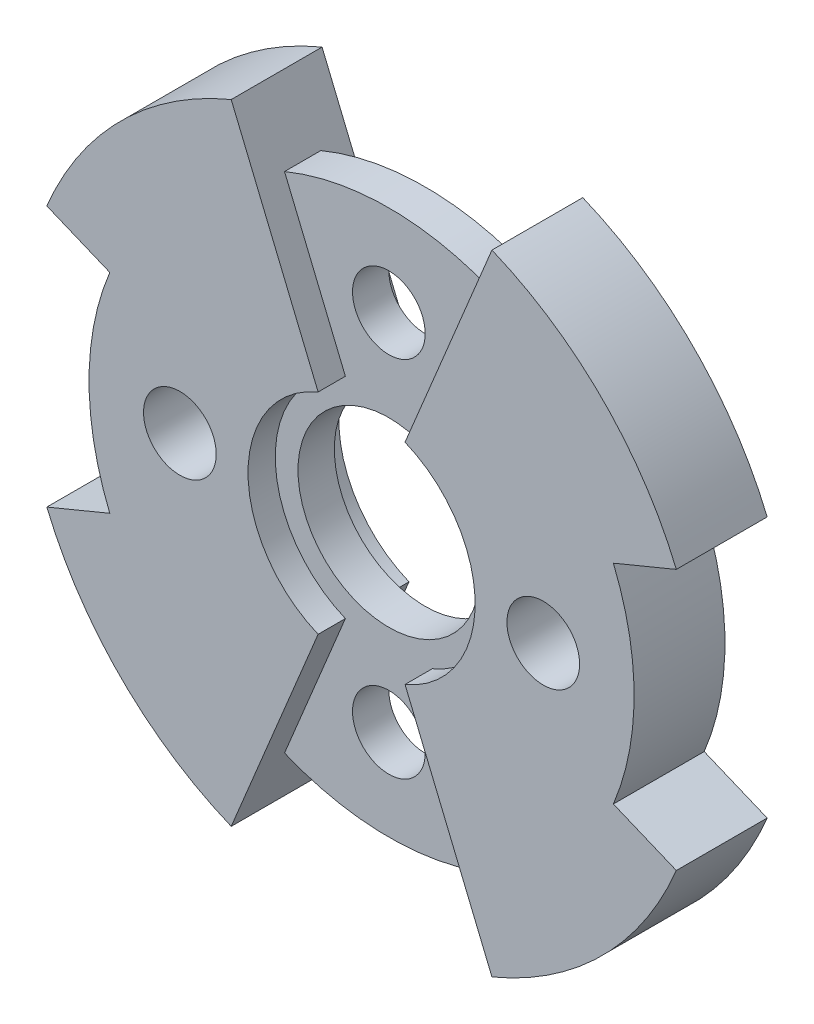
ISO-10303-21;
HEADER;
FILE_DESCRIPTION(('STEP AP214'),'2;1');
FILE_NAME('part.step','',(''),(''),'','','');
FILE_SCHEMA(('AUTOMOTIVE_DESIGN { 1 0 10303 214 1 1 1 1 }'));
ENDSEC;
DATA;
#1=APPLICATION_CONTEXT('core data for automotive mechanical design processes');
#2=APPLICATION_PROTOCOL_DEFINITION('international standard','automotive_design',2000,#1);
#3=PRODUCT_CONTEXT('',#1,'mechanical');
#4=PRODUCT('Part','Part','',(#3));
#5=PRODUCT_RELATED_PRODUCT_CATEGORY('part','',(#4));
#6=PRODUCT_DEFINITION_FORMATION('','',#4);
#7=PRODUCT_DEFINITION_CONTEXT('part definition',#1,'design');
#8=PRODUCT_DEFINITION('design','',#6,#7);
#9=PRODUCT_DEFINITION_SHAPE('','',#8);
#10=(LENGTH_UNIT() NAMED_UNIT(*) SI_UNIT(.MILLI.,.METRE.));
#11=(NAMED_UNIT(*) PLANE_ANGLE_UNIT() SI_UNIT($,.RADIAN.));
#12=(NAMED_UNIT(*) SI_UNIT($,.STERADIAN.) SOLID_ANGLE_UNIT());
#13=UNCERTAINTY_MEASURE_WITH_UNIT(LENGTH_MEASURE(1.E-05),#10,'distance_accuracy_value','');
#14=(GEOMETRIC_REPRESENTATION_CONTEXT(3) GLOBAL_UNCERTAINTY_ASSIGNED_CONTEXT((#13)) GLOBAL_UNIT_ASSIGNED_CONTEXT((#10,
#11,#12)) REPRESENTATION_CONTEXT('',''));
#15=CARTESIAN_POINT('',(0.,0.,0.));
#16=DIRECTION('',(0.,0.,1.));
#17=DIRECTION('',(1.,0.,0.));
#18=AXIS2_PLACEMENT_3D('',#15,#16,#17);
#19=CARTESIAN_POINT('',(0.,0.,10.));
#20=DIRECTION('',(0.,0.,-1.));
#21=DIRECTION('',(-1.,0.,0.));
#22=AXIS2_PLACEMENT_3D('',#19,#20,#21);
#23=CYLINDRICAL_SURFACE('',#22,25.);
#24=DIRECTION('',(0.,0.,-1.));
#25=VECTOR('',#24,1.);
#26=CARTESIAN_POINT('',(9.56708580912726,-23.0969883127822,10.));
#27=LINE('',#26,#25);
#28=CARTESIAN_POINT('',(9.56708580912726,-23.0969883127822,-4.));
#29=VERTEX_POINT('',#28);
#30=CARTESIAN_POINT('',(9.56708580912726,-23.0969883127822,-10.));
#31=VERTEX_POINT('',#30);
#32=EDGE_CURVE('E409',#29,#31,#27,.T.);
#33=ORIENTED_EDGE('',*,*,#32,.F.);
#34=CARTESIAN_POINT('',(0.,0.,-4.));
#35=DIRECTION('',(0.,0.,1.));
#36=DIRECTION('',(1.,0.,0.));
#37=AXIS2_PLACEMENT_3D('',#34,#35,#36);
#38=CIRCLE('',#37,25.);
#39=CARTESIAN_POINT('',(9.56708580912726,23.0969883127822,-4.));
#40=VERTEX_POINT('',#39);
#41=EDGE_CURVE('E325',#29,#40,#38,.T.);
#42=ORIENTED_EDGE('',*,*,#41,.T.);
#43=DIRECTION('',(0.,0.,-1.));
#44=VECTOR('',#43,1.);
#45=CARTESIAN_POINT('',(9.56708580912726,23.0969883127822,10.));
#46=LINE('',#45,#44);
#47=CARTESIAN_POINT('',(9.56708580912726,23.0969883127822,-10.));
#48=VERTEX_POINT('',#47);
#49=EDGE_CURVE('E49',#40,#48,#46,.T.);
#50=ORIENTED_EDGE('',*,*,#49,.T.);
#51=CARTESIAN_POINT('',(0.,0.,-10.));
#52=DIRECTION('',(0.,0.,1.));
#53=DIRECTION('',(1.,0.,0.));
#54=AXIS2_PLACEMENT_3D('',#51,#52,#53);
#55=CIRCLE('',#54,25.);
#56=EDGE_CURVE('E376',#31,#48,#55,.T.);
#57=ORIENTED_EDGE('',*,*,#56,.F.);
#58=EDGE_LOOP('',(#33,#42,#50,#57));
#59=FACE_BOUND('',#58,.T.);
#60=ADVANCED_FACE('F41',(#59),#23,.F.);
#61=CARTESIAN_POINT('',(0.,0.,10.));
#62=DIRECTION('',(-0.923879532511287,0.382683432365091,0.));
#63=DIRECTION('',(-0.382683432365091,-0.923879532511287,0.));
#64=AXIS2_PLACEMENT_3D('',#61,#62,#63);
#65=PLANE('',#64);
#66=DIRECTION('',(0.382683432365091,0.923879532511287,0.));
#67=VECTOR('',#66,1.);
#68=CARTESIAN_POINT('',(0.,0.,4.));
#69=LINE('',#68,#67);
#70=CARTESIAN_POINT('',(9.56708580912726,23.0969883127822,4.));
#71=VERTEX_POINT('',#70);
#72=CARTESIAN_POINT('',(22.9610059419054,55.4327719506772,4.));
#73=VERTEX_POINT('',#72);
#74=EDGE_CURVE('E299',#71,#73,#69,.T.);
#75=ORIENTED_EDGE('',*,*,#74,.F.);
#76=CARTESIAN_POINT('',(9.56708580912726,23.0969883127822,10.));
#77=VERTEX_POINT('',#76);
#78=EDGE_CURVE('E11',#77,#71,#46,.T.);
#79=ORIENTED_EDGE('',*,*,#78,.F.);
#80=DIRECTION('',(0.382683432365091,0.923879532511287,0.));
#81=VECTOR('',#80,1.);
#82=CARTESIAN_POINT('',(0.,0.,10.));
#83=LINE('',#82,#81);
#84=CARTESIAN_POINT('',(28.7012574273818,69.2909649383465,10.));
#85=VERTEX_POINT('',#84);
#86=EDGE_CURVE('E350',#77,#85,#83,.T.);
#87=ORIENTED_EDGE('',*,*,#86,.T.);
#88=DIRECTION('',(0.,0.,-1.));
#89=VECTOR('',#88,1.);
#90=CARTESIAN_POINT('',(28.7012574273818,69.2909649383465,10.));
#91=LINE('',#90,#89);
#92=CARTESIAN_POINT('',(28.7012574273818,69.2909649383465,-10.));
#93=VERTEX_POINT('',#92);
#94=EDGE_CURVE('E373',#85,#93,#91,.T.);
#95=ORIENTED_EDGE('',*,*,#94,.T.);
#96=DIRECTION('',(0.382683432365091,0.923879532511287,0.));
#97=VECTOR('',#96,1.);
#98=CARTESIAN_POINT('',(0.,0.,-10.));
#99=LINE('',#98,#97);
#100=EDGE_CURVE('E349',#48,#93,#99,.T.);
#101=ORIENTED_EDGE('',*,*,#100,.F.);
#102=ORIENTED_EDGE('',*,*,#49,.F.);
#103=DIRECTION('',(0.382683432365091,0.923879532511287,0.));
#104=VECTOR('',#103,1.);
#105=CARTESIAN_POINT('',(0.,0.,-4.));
#106=LINE('',#105,#104);
#107=CARTESIAN_POINT('',(22.9610059419054,55.4327719506772,-4.));
#108=VERTEX_POINT('',#107);
#109=EDGE_CURVE('E61',#40,#108,#106,.T.);
#110=ORIENTED_EDGE('',*,*,#109,.T.);
#111=DIRECTION('',(0.,0.,-1.));
#112=VECTOR('',#111,1.);
#113=CARTESIAN_POINT('',(22.9610059419054,55.4327719506772,4.));
#114=LINE('',#113,#112);
#115=EDGE_CURVE('E56',#73,#108,#114,.T.);
#116=ORIENTED_EDGE('',*,*,#115,.F.);
#117=EDGE_LOOP('',(#75,#79,#87,#95,#101,#102,#110,#116));
#118=FACE_BOUND('',#117,.T.);
#119=ADVANCED_FACE('F43',(#118),#65,.T.);
#120=CARTESIAN_POINT('',(0.,0.,4.));
#121=DIRECTION('',(0.,0.,1.));
#122=DIRECTION('',(1.,0.,0.));
#123=AXIS2_PLACEMENT_3D('',#120,#121,#122);
#124=CIRCLE('',#123,25.);
#125=CARTESIAN_POINT('',(9.56708580912726,-23.0969883127822,4.));
#126=VERTEX_POINT('',#125);
#127=EDGE_CURVE('E296',#126,#71,#124,.T.);
#128=ORIENTED_EDGE('',*,*,#127,.F.);
#129=CARTESIAN_POINT('',(9.56708580912726,-23.0969883127822,10.));
#130=VERTEX_POINT('',#129);
#131=EDGE_CURVE('E410',#130,#126,#27,.T.);
#132=ORIENTED_EDGE('',*,*,#131,.F.);
#133=CARTESIAN_POINT('',(0.,0.,10.));
#134=DIRECTION('',(0.,0.,1.));
#135=DIRECTION('',(1.,0.,0.));
#136=AXIS2_PLACEMENT_3D('',#133,#134,#135);
#137=CIRCLE('',#136,25.);
#138=EDGE_CURVE('E353',#130,#77,#137,.T.);
#139=ORIENTED_EDGE('',*,*,#138,.T.);
#140=ORIENTED_EDGE('',*,*,#78,.T.);
#141=EDGE_LOOP('',(#128,#132,#139,#140));
#142=FACE_BOUND('',#141,.T.);
#143=ADVANCED_FACE('F456',(#142),#23,.F.);
#144=CARTESIAN_POINT('',(0.,0.,10.));
#145=DIRECTION('',(0.923879532511287,0.382683432365091,0.));
#146=DIRECTION('',(-0.382683432365091,0.923879532511287,0.));
#147=AXIS2_PLACEMENT_3D('',#144,#145,#146);
#148=PLANE('',#147);
#149=ORIENTED_EDGE('',*,*,#131,.T.);
#150=DIRECTION('',(0.382683432365091,-0.923879532511287,0.));
#151=VECTOR('',#150,1.);
#152=CARTESIAN_POINT('',(0.,0.,4.));
#153=LINE('',#152,#151);
#154=CARTESIAN_POINT('',(22.9610059419054,-55.4327719506772,4.));
#155=VERTEX_POINT('',#154);
#156=EDGE_CURVE('E294',#126,#155,#153,.T.);
#157=ORIENTED_EDGE('',*,*,#156,.T.);
#158=DIRECTION('',(0.,0.,-1.));
#159=VECTOR('',#158,1.);
#160=CARTESIAN_POINT('',(22.9610059419054,-55.4327719506772,4.));
#161=LINE('',#160,#159);
#162=CARTESIAN_POINT('',(22.9610059419054,-55.4327719506772,-4.));
#163=VERTEX_POINT('',#162);
#164=EDGE_CURVE('E344',#155,#163,#161,.T.);
#165=ORIENTED_EDGE('',*,*,#164,.T.);
#166=DIRECTION('',(0.382683432365091,-0.923879532511287,0.));
#167=VECTOR('',#166,1.);
#168=CARTESIAN_POINT('',(0.,0.,-4.));
#169=LINE('',#168,#167);
#170=EDGE_CURVE('E322',#29,#163,#169,.T.);
#171=ORIENTED_EDGE('',*,*,#170,.F.);
#172=ORIENTED_EDGE('',*,*,#32,.T.);
#173=DIRECTION('',(0.382683432365091,-0.923879532511287,0.));
#174=VECTOR('',#173,1.);
#175=CARTESIAN_POINT('',(0.,0.,-10.));
#176=LINE('',#175,#174);
#177=CARTESIAN_POINT('',(28.7012574273818,-69.2909649383465,-10.));
#178=VERTEX_POINT('',#177);
#179=EDGE_CURVE('E379',#31,#178,#176,.T.);
#180=ORIENTED_EDGE('',*,*,#179,.T.);
#181=DIRECTION('',(0.,0.,-1.));
#182=VECTOR('',#181,1.);
#183=CARTESIAN_POINT('',(28.7012574273818,-69.2909649383465,10.));
#184=LINE('',#183,#182);
#185=CARTESIAN_POINT('',(28.7012574273818,-69.2909649383465,10.));
#186=VERTEX_POINT('',#185);
#187=EDGE_CURVE('E407',#186,#178,#184,.T.);
#188=ORIENTED_EDGE('',*,*,#187,.F.);
#189=DIRECTION('',(0.382683432365091,-0.923879532511287,0.));
#190=VECTOR('',#189,1.);
#191=CARTESIAN_POINT('',(0.,0.,10.));
#192=LINE('',#191,#190);
#193=EDGE_CURVE('E357',#130,#186,#192,.T.);
#194=ORIENTED_EDGE('',*,*,#193,.F.);
#195=EDGE_LOOP('',(#149,#157,#165,#171,#172,#180,#188,#194));
#196=FACE_BOUND('',#195,.T.);
#197=ADVANCED_FACE('F417',(#196),#148,.F.);
#198=CARTESIAN_POINT('',(0.,0.,10.));
#199=DIRECTION('',(0.,0.,-1.));
#200=DIRECTION('',(-1.,0.,0.));
#201=AXIS2_PLACEMENT_3D('',#198,#199,#200);
#202=CYLINDRICAL_SURFACE('',#201,75.);
#203=CARTESIAN_POINT('',(0.,0.,-10.));
#204=DIRECTION('',(0.,0.,1.));
#205=DIRECTION('',(1.,0.,0.));
#206=AXIS2_PLACEMENT_3D('',#203,#204,#205);
#207=CIRCLE('',#206,75.);
#208=CARTESIAN_POINT('',(69.2909649383465,-28.7012574273818,-10.));
#209=VERTEX_POINT('',#208);
#210=EDGE_CURVE('E381',#178,#209,#207,.T.);
#211=ORIENTED_EDGE('',*,*,#210,.T.);
#212=DIRECTION('',(0.,0.,-1.));
#213=VECTOR('',#212,1.);
#214=CARTESIAN_POINT('',(69.2909649383465,-28.7012574273818,10.));
#215=LINE('',#214,#213);
#216=CARTESIAN_POINT('',(69.2909649383465,-28.7012574273818,10.));
#217=VERTEX_POINT('',#216);
#218=EDGE_CURVE('E405',#217,#209,#215,.T.);
#219=ORIENTED_EDGE('',*,*,#218,.F.);
#220=CARTESIAN_POINT('',(0.,0.,10.));
#221=DIRECTION('',(0.,0.,1.));
#222=DIRECTION('',(1.,0.,0.));
#223=AXIS2_PLACEMENT_3D('',#220,#221,#222);
#224=CIRCLE('',#223,75.);
#225=EDGE_CURVE('E359',#186,#217,#224,.T.);
#226=ORIENTED_EDGE('',*,*,#225,.F.);
#227=ORIENTED_EDGE('',*,*,#187,.T.);
#228=EDGE_LOOP('',(#211,#219,#226,#227));
#229=FACE_BOUND('',#228,.T.);
#230=ADVANCED_FACE('F449',(#229),#202,.T.);
#231=CARTESIAN_POINT('',(0.,0.,10.));
#232=DIRECTION('',(0.382683432365091,0.923879532511287,0.));
#233=DIRECTION('',(-0.923879532511287,0.382683432365091,0.));
#234=AXIS2_PLACEMENT_3D('',#231,#232,#233);
#235=PLANE('',#234);
#236=DIRECTION('',(0.923879532511286,-0.382683432365091,0.));
#237=VECTOR('',#236,1.);
#238=CARTESIAN_POINT('',(0.,0.,-10.));
#239=LINE('',#238,#237);
#240=CARTESIAN_POINT('',(55.4327719506772,-22.9610059419054,-10.));
#241=VERTEX_POINT('',#240);
#242=EDGE_CURVE('E384',#241,#209,#239,.T.);
#243=ORIENTED_EDGE('',*,*,#242,.F.);
#244=DIRECTION('',(0.,0.,-1.));
#245=VECTOR('',#244,1.);
#246=CARTESIAN_POINT('',(55.4327719506772,-22.9610059419054,10.));
#247=LINE('',#246,#245);
#248=CARTESIAN_POINT('',(55.4327719506772,-22.9610059419054,10.));
#249=VERTEX_POINT('',#248);
#250=EDGE_CURVE('E403',#249,#241,#247,.T.);
#251=ORIENTED_EDGE('',*,*,#250,.F.);
#252=DIRECTION('',(0.923879532511286,-0.382683432365091,0.));
#253=VECTOR('',#252,1.);
#254=CARTESIAN_POINT('',(0.,0.,10.));
#255=LINE('',#254,#253);
#256=EDGE_CURVE('E361',#249,#217,#255,.T.);
#257=ORIENTED_EDGE('',*,*,#256,.T.);
#258=ORIENTED_EDGE('',*,*,#218,.T.);
#259=EDGE_LOOP('',(#243,#251,#257,#258));
#260=FACE_BOUND('',#259,.T.);
#261=ADVANCED_FACE('F445',(#260),#235,.T.);
#262=CARTESIAN_POINT('',(0.,0.,10.));
#263=DIRECTION('',(0.,0.,-1.));
#264=DIRECTION('',(-1.,0.,0.));
#265=AXIS2_PLACEMENT_3D('',#262,#263,#264);
#266=CYLINDRICAL_SURFACE('',#265,60.);
#267=CARTESIAN_POINT('',(0.,0.,-10.));
#268=DIRECTION('',(0.,0.,1.));
#269=DIRECTION('',(1.,0.,0.));
#270=AXIS2_PLACEMENT_3D('',#267,#268,#269);
#271=CIRCLE('',#270,60.);
#272=CARTESIAN_POINT('',(55.4327719506772,22.9610059419054,-10.));
#273=VERTEX_POINT('',#272);
#274=EDGE_CURVE('E387',#241,#273,#271,.T.);
#275=ORIENTED_EDGE('',*,*,#274,.T.);
#276=DIRECTION('',(0.,0.,-1.));
#277=VECTOR('',#276,1.);
#278=CARTESIAN_POINT('',(55.4327719506772,22.9610059419054,10.));
#279=LINE('',#278,#277);
#280=CARTESIAN_POINT('',(55.4327719506772,22.9610059419054,10.));
#281=VERTEX_POINT('',#280);
#282=EDGE_CURVE('E400',#281,#273,#279,.T.);
#283=ORIENTED_EDGE('',*,*,#282,.F.);
#284=CARTESIAN_POINT('',(0.,0.,10.));
#285=DIRECTION('',(0.,0.,1.));
#286=DIRECTION('',(1.,0.,0.));
#287=AXIS2_PLACEMENT_3D('',#284,#285,#286);
#288=CIRCLE('',#287,60.);
#289=EDGE_CURVE('E364',#249,#281,#288,.T.);
#290=ORIENTED_EDGE('',*,*,#289,.F.);
#291=ORIENTED_EDGE('',*,*,#250,.T.);
#292=EDGE_LOOP('',(#275,#283,#290,#291));
#293=FACE_BOUND('',#292,.T.);
#294=ADVANCED_FACE('F441',(#293),#266,.T.);
#295=CARTESIAN_POINT('',(0.,0.,10.));
#296=DIRECTION('',(-0.382683432365091,0.923879532511287,0.));
#297=DIRECTION('',(-0.923879532511287,-0.382683432365091,0.));
#298=AXIS2_PLACEMENT_3D('',#295,#296,#297);
#299=PLANE('',#298);
#300=DIRECTION('',(0.923879532511286,0.382683432365091,0.));
#301=VECTOR('',#300,1.);
#302=CARTESIAN_POINT('',(0.,0.,-10.));
#303=LINE('',#302,#301);
#304=CARTESIAN_POINT('',(69.2909649383465,28.7012574273818,-10.));
#305=VERTEX_POINT('',#304);
#306=EDGE_CURVE('E389',#273,#305,#303,.T.);
#307=ORIENTED_EDGE('',*,*,#306,.T.);
#308=DIRECTION('',(0.,0.,-1.));
#309=VECTOR('',#308,1.);
#310=CARTESIAN_POINT('',(69.2909649383465,28.7012574273818,10.));
#311=LINE('',#310,#309);
#312=CARTESIAN_POINT('',(69.2909649383465,28.7012574273818,10.));
#313=VERTEX_POINT('',#312);
#314=EDGE_CURVE('E397',#313,#305,#311,.T.);
#315=ORIENTED_EDGE('',*,*,#314,.F.);
#316=DIRECTION('',(0.923879532511286,0.382683432365091,0.));
#317=VECTOR('',#316,1.);
#318=CARTESIAN_POINT('',(0.,0.,10.));
#319=LINE('',#318,#317);
#320=EDGE_CURVE('E366',#281,#313,#319,.T.);
#321=ORIENTED_EDGE('',*,*,#320,.F.);
#322=ORIENTED_EDGE('',*,*,#282,.T.);
#323=EDGE_LOOP('',(#307,#315,#321,#322));
#324=FACE_BOUND('',#323,.T.);
#325=ADVANCED_FACE('F437',(#324),#299,.F.);
#326=CARTESIAN_POINT('',(0.,0.,10.));
#327=DIRECTION('',(0.,0.,-1.));
#328=DIRECTION('',(-1.,0.,0.));
#329=AXIS2_PLACEMENT_3D('',#326,#327,#328);
#330=CYLINDRICAL_SURFACE('',#329,75.);
#331=CARTESIAN_POINT('',(0.,0.,-10.));
#332=DIRECTION('',(0.,0.,1.));
#333=DIRECTION('',(1.,0.,0.));
#334=AXIS2_PLACEMENT_3D('',#331,#332,#333);
#335=CIRCLE('',#334,75.);
#336=EDGE_CURVE('E391',#305,#93,#335,.T.);
#337=ORIENTED_EDGE('',*,*,#336,.T.);
#338=ORIENTED_EDGE('',*,*,#94,.F.);
#339=CARTESIAN_POINT('',(0.,0.,10.));
#340=DIRECTION('',(0.,0.,1.));
#341=DIRECTION('',(1.,0.,0.));
#342=AXIS2_PLACEMENT_3D('',#339,#340,#341);
#343=CIRCLE('',#342,75.);
#344=EDGE_CURVE('E368',#313,#85,#343,.T.);
#345=ORIENTED_EDGE('',*,*,#344,.F.);
#346=ORIENTED_EDGE('',*,*,#314,.T.);
#347=EDGE_LOOP('',(#337,#338,#345,#346));
#348=FACE_BOUND('',#347,.T.);
#349=ADVANCED_FACE('F432',(#348),#330,.T.);
#350=CARTESIAN_POINT('',(40.,0.,10.));
#351=DIRECTION('',(0.,0.,-1.));
#352=DIRECTION('',(-1.,0.,0.));
#353=AXIS2_PLACEMENT_3D('',#350,#351,#352);
#354=CYLINDRICAL_SURFACE('',#353,8.);
#355=CARTESIAN_POINT('',(40.,0.,10.));
#356=DIRECTION('',(0.,0.,1.));
#357=DIRECTION('',(1.,0.,0.));
#358=AXIS2_PLACEMENT_3D('',#355,#356,#357);
#359=CIRCLE('',#358,8.);
#360=CARTESIAN_POINT('',(48.,0.,10.));
#361=VERTEX_POINT('',#360);
#362=EDGE_CURVE('E370',#361,#361,#359,.T.);
#363=ORIENTED_EDGE('',*,*,#362,.T.);
#364=EDGE_LOOP('',(#363));
#365=FACE_BOUND('',#364,.T.);
#366=CARTESIAN_POINT('',(40.,0.,-10.));
#367=DIRECTION('',(0.,0.,1.));
#368=DIRECTION('',(1.,0.,0.));
#369=AXIS2_PLACEMENT_3D('',#366,#367,#368);
#370=CIRCLE('',#369,8.);
#371=CARTESIAN_POINT('',(48.,0.,-10.));
#372=VERTEX_POINT('',#371);
#373=EDGE_CURVE('E354',#372,#372,#370,.T.);
#374=ORIENTED_EDGE('',*,*,#373,.F.);
#375=EDGE_LOOP('',(#374));
#376=FACE_BOUND('',#375,.T.);
#377=ADVANCED_FACE('F538',(#365,#376),#354,.F.);
#378=CARTESIAN_POINT('',(0.,0.,10.));
#379=DIRECTION('',(0.,0.,1.));
#380=DIRECTION('',(1.,0.,0.));
#381=AXIS2_PLACEMENT_3D('',#378,#379,#380);
#382=PLANE('',#381);
#383=ORIENTED_EDGE('',*,*,#86,.F.);
#384=ORIENTED_EDGE('',*,*,#138,.F.);
#385=ORIENTED_EDGE('',*,*,#193,.T.);
#386=ORIENTED_EDGE('',*,*,#225,.T.);
#387=ORIENTED_EDGE('',*,*,#256,.F.);
#388=ORIENTED_EDGE('',*,*,#289,.T.);
#389=ORIENTED_EDGE('',*,*,#320,.T.);
#390=ORIENTED_EDGE('',*,*,#344,.T.);
#391=EDGE_LOOP('',(#383,#384,#385,#386,#387,#388,#389,#390));
#392=FACE_BOUND('',#391,.T.);
#393=ORIENTED_EDGE('',*,*,#362,.F.);
#394=EDGE_LOOP('',(#393));
#395=FACE_BOUND('',#394,.T.);
#396=ADVANCED_FACE('F453',(#392,#395),#382,.T.);
#397=CARTESIAN_POINT('',(0.,0.,-10.));
#398=DIRECTION('',(0.,0.,1.));
#399=DIRECTION('',(1.,0.,0.));
#400=AXIS2_PLACEMENT_3D('',#397,#398,#399);
#401=PLANE('',#400);
#402=ORIENTED_EDGE('',*,*,#100,.T.);
#403=ORIENTED_EDGE('',*,*,#336,.F.);
#404=ORIENTED_EDGE('',*,*,#306,.F.);
#405=ORIENTED_EDGE('',*,*,#274,.F.);
#406=ORIENTED_EDGE('',*,*,#242,.T.);
#407=ORIENTED_EDGE('',*,*,#210,.F.);
#408=ORIENTED_EDGE('',*,*,#179,.F.);
#409=ORIENTED_EDGE('',*,*,#56,.T.);
#410=EDGE_LOOP('',(#402,#403,#404,#405,#406,#407,#408,#409));
#411=FACE_BOUND('',#410,.T.);
#412=ORIENTED_EDGE('',*,*,#373,.T.);
#413=EDGE_LOOP('',(#412));
#414=FACE_BOUND('',#413,.T.);
#415=ADVANCED_FACE('F424',(#411,#414),#401,.F.);
#416=CARTESIAN_POINT('',(0.,0.,4.));
#417=DIRECTION('',(0.,0.,-1.));
#418=DIRECTION('',(-1.,0.,0.));
#419=AXIS2_PLACEMENT_3D('',#416,#417,#418);
#420=CYLINDRICAL_SURFACE('',#419,60.);
#421=CARTESIAN_POINT('',(0.,0.,-4.));
#422=DIRECTION('',(0.,0.,1.));
#423=DIRECTION('',(1.,0.,0.));
#424=AXIS2_PLACEMENT_3D('',#421,#422,#423);
#425=CIRCLE('',#424,60.);
#426=CARTESIAN_POINT('',(-22.9610059419054,-55.4327719506772,-4.));
#427=VERTEX_POINT('',#426);
#428=EDGE_CURVE('E319',#427,#163,#425,.T.);
#429=ORIENTED_EDGE('',*,*,#428,.T.);
#430=ORIENTED_EDGE('',*,*,#164,.F.);
#431=CARTESIAN_POINT('',(0.,0.,4.));
#432=DIRECTION('',(0.,0.,1.));
#433=DIRECTION('',(1.,0.,0.));
#434=AXIS2_PLACEMENT_3D('',#431,#432,#433);
#435=CIRCLE('',#434,60.);
#436=CARTESIAN_POINT('',(-22.9610059419054,-55.4327719506772,4.));
#437=VERTEX_POINT('',#436);
#438=EDGE_CURVE('E291',#437,#155,#435,.T.);
#439=ORIENTED_EDGE('',*,*,#438,.F.);
#440=DIRECTION('',(0.,0.,-1.));
#441=VECTOR('',#440,1.);
#442=CARTESIAN_POINT('',(-22.9610059419054,-55.4327719506772,4.));
#443=LINE('',#442,#441);
#444=EDGE_CURVE('E346',#437,#427,#443,.T.);
#445=ORIENTED_EDGE('',*,*,#444,.T.);
#446=EDGE_LOOP('',(#429,#430,#439,#445));
#447=FACE_BOUND('',#446,.T.);
#448=ADVANCED_FACE('F465',(#447),#420,.T.);
#449=CARTESIAN_POINT('',(0.,0.,4.));
#450=DIRECTION('',(0.,0.,-1.));
#451=DIRECTION('',(-1.,0.,0.));
#452=AXIS2_PLACEMENT_3D('',#449,#450,#451);
#453=CYLINDRICAL_SURFACE('',#452,60.);
#454=CARTESIAN_POINT('',(0.,0.,-4.));
#455=DIRECTION('',(0.,0.,1.));
#456=DIRECTION('',(1.,0.,0.));
#457=AXIS2_PLACEMENT_3D('',#454,#455,#456);
#458=CIRCLE('',#457,60.);
#459=CARTESIAN_POINT('',(-22.9610059419054,55.4327719506772,-4.));
#460=VERTEX_POINT('',#459);
#461=EDGE_CURVE('E328',#108,#460,#458,.T.);
#462=ORIENTED_EDGE('',*,*,#461,.T.);
#463=DIRECTION('',(0.,0.,-1.));
#464=VECTOR('',#463,1.);
#465=CARTESIAN_POINT('',(-22.9610059419054,55.4327719506772,4.));
#466=LINE('',#465,#464);
#467=CARTESIAN_POINT('',(-22.9610059419054,55.4327719506772,4.));
#468=VERTEX_POINT('',#467);
#469=EDGE_CURVE('E315',#468,#460,#466,.T.);
#470=ORIENTED_EDGE('',*,*,#469,.F.);
#471=CARTESIAN_POINT('',(0.,0.,4.));
#472=DIRECTION('',(0.,0.,1.));
#473=DIRECTION('',(1.,0.,0.));
#474=AXIS2_PLACEMENT_3D('',#471,#472,#473);
#475=CIRCLE('',#474,60.);
#476=EDGE_CURVE('E301',#73,#468,#475,.T.);
#477=ORIENTED_EDGE('',*,*,#476,.F.);
#478=ORIENTED_EDGE('',*,*,#115,.T.);
#479=EDGE_LOOP('',(#462,#470,#477,#478));
#480=FACE_BOUND('',#479,.T.);
#481=ADVANCED_FACE('F474',(#480),#453,.T.);
#482=CARTESIAN_POINT('',(0.,0.,4.));
#483=DIRECTION('',(0.,0.,-1.));
#484=DIRECTION('',(-1.,0.,0.));
#485=AXIS2_PLACEMENT_3D('',#482,#483,#484);
#486=CYLINDRICAL_SURFACE('',#485,20.);
#487=CARTESIAN_POINT('',(0.,0.,4.));
#488=DIRECTION('',(0.,0.,1.));
#489=DIRECTION('',(1.,0.,0.));
#490=AXIS2_PLACEMENT_3D('',#487,#488,#489);
#491=CIRCLE('',#490,20.);
#492=CARTESIAN_POINT('',(20.,0.,4.));
#493=VERTEX_POINT('',#492);
#494=EDGE_CURVE('E309',#493,#493,#491,.T.);
#495=ORIENTED_EDGE('',*,*,#494,.T.);
#496=EDGE_LOOP('',(#495));
#497=FACE_BOUND('',#496,.T.);
#498=CARTESIAN_POINT('',(0.,0.,-4.));
#499=DIRECTION('',(0.,0.,1.));
#500=DIRECTION('',(1.,0.,0.));
#501=AXIS2_PLACEMENT_3D('',#498,#499,#500);
#502=CIRCLE('',#501,20.);
#503=CARTESIAN_POINT('',(20.,0.,-4.));
#504=VERTEX_POINT('',#503);
#505=EDGE_CURVE('E337',#504,#504,#502,.T.);
#506=ORIENTED_EDGE('',*,*,#505,.F.);
#507=EDGE_LOOP('',(#506));
#508=FACE_BOUND('',#507,.T.);
#509=ADVANCED_FACE('F550',(#497,#508),#486,.F.);
#510=CARTESIAN_POINT('',(0.,40.,4.));
#511=DIRECTION('',(0.,0.,-1.));
#512=DIRECTION('',(-1.,0.,0.));
#513=AXIS2_PLACEMENT_3D('',#510,#511,#512);
#514=CYLINDRICAL_SURFACE('',#513,8.);
#515=CARTESIAN_POINT('',(0.,40.,4.));
#516=DIRECTION('',(0.,0.,1.));
#517=DIRECTION('',(1.,0.,0.));
#518=AXIS2_PLACEMENT_3D('',#515,#516,#517);
#519=CIRCLE('',#518,8.);
#520=CARTESIAN_POINT('',(8.,40.,4.));
#521=VERTEX_POINT('',#520);
#522=EDGE_CURVE('E306',#521,#521,#519,.T.);
#523=ORIENTED_EDGE('',*,*,#522,.T.);
#524=EDGE_LOOP('',(#523));
#525=FACE_BOUND('',#524,.T.);
#526=CARTESIAN_POINT('',(0.,40.,-4.));
#527=DIRECTION('',(0.,0.,1.));
#528=DIRECTION('',(1.,0.,0.));
#529=AXIS2_PLACEMENT_3D('',#526,#527,#528);
#530=CIRCLE('',#529,8.);
#531=CARTESIAN_POINT('',(8.,40.,-4.));
#532=VERTEX_POINT('',#531);
#533=EDGE_CURVE('E334',#532,#532,#530,.T.);
#534=ORIENTED_EDGE('',*,*,#533,.F.);
#535=EDGE_LOOP('',(#534));
#536=FACE_BOUND('',#535,.T.);
#537=ADVANCED_FACE('F551',(#525,#536),#514,.F.);
#538=CARTESIAN_POINT('',(0.,-40.,4.));
#539=DIRECTION('',(0.,0.,-1.));
#540=DIRECTION('',(-1.,0.,0.));
#541=AXIS2_PLACEMENT_3D('',#538,#539,#540);
#542=CYLINDRICAL_SURFACE('',#541,8.);
#543=CARTESIAN_POINT('',(0.,-40.,4.));
#544=DIRECTION('',(0.,0.,1.));
#545=DIRECTION('',(1.,0.,0.));
#546=AXIS2_PLACEMENT_3D('',#543,#544,#545);
#547=CIRCLE('',#546,8.);
#548=CARTESIAN_POINT('',(8.,-40.,4.));
#549=VERTEX_POINT('',#548);
#550=EDGE_CURVE('E312',#549,#549,#547,.T.);
#551=ORIENTED_EDGE('',*,*,#550,.T.);
#552=EDGE_LOOP('',(#551));
#553=FACE_BOUND('',#552,.T.);
#554=CARTESIAN_POINT('',(0.,-40.,-4.));
#555=DIRECTION('',(0.,0.,1.));
#556=DIRECTION('',(1.,0.,0.));
#557=AXIS2_PLACEMENT_3D('',#554,#555,#556);
#558=CIRCLE('',#557,8.);
#559=CARTESIAN_POINT('',(8.,-40.,-4.));
#560=VERTEX_POINT('',#559);
#561=EDGE_CURVE('E288',#560,#560,#558,.T.);
#562=ORIENTED_EDGE('',*,*,#561,.F.);
#563=EDGE_LOOP('',(#562));
#564=FACE_BOUND('',#563,.T.);
#565=ADVANCED_FACE('F554',(#553,#564),#542,.F.);
#566=CARTESIAN_POINT('',(0.,0.,4.));
#567=DIRECTION('',(0.,0.,1.));
#568=DIRECTION('',(1.,0.,0.));
#569=AXIS2_PLACEMENT_3D('',#566,#567,#568);
#570=PLANE('',#569);
#571=CARTESIAN_POINT('',(0.,0.,4.));
#572=DIRECTION('',(0.,0.,1.));
#573=DIRECTION('',(1.,0.,0.));
#574=AXIS2_PLACEMENT_3D('',#571,#572,#573);
#575=CIRCLE('',#574,25.);
#576=CARTESIAN_POINT('',(-9.56708580912726,23.0969883127822,4.));
#577=VERTEX_POINT('',#576);
#578=CARTESIAN_POINT('',(-9.56708580912726,-23.0969883127822,4.));
#579=VERTEX_POINT('',#578);
#580=EDGE_CURVE('E284',#577,#579,#575,.T.);
#581=ORIENTED_EDGE('',*,*,#580,.T.);
#582=DIRECTION('',(-0.382683432365091,-0.923879532511287,0.));
#583=VECTOR('',#582,1.);
#584=CARTESIAN_POINT('',(0.,0.,4.));
#585=LINE('',#584,#583);
#586=EDGE_CURVE('E287',#579,#437,#585,.T.);
#587=ORIENTED_EDGE('',*,*,#586,.T.);
#588=ORIENTED_EDGE('',*,*,#438,.T.);
#589=ORIENTED_EDGE('',*,*,#156,.F.);
#590=ORIENTED_EDGE('',*,*,#127,.T.);
#591=ORIENTED_EDGE('',*,*,#74,.T.);
#592=ORIENTED_EDGE('',*,*,#476,.T.);
#593=DIRECTION('',(-0.382683432365091,0.923879532511287,0.));
#594=VECTOR('',#593,1.);
#595=CARTESIAN_POINT('',(0.,0.,4.));
#596=LINE('',#595,#594);
#597=EDGE_CURVE('E304',#577,#468,#596,.T.);
#598=ORIENTED_EDGE('',*,*,#597,.F.);
#599=EDGE_LOOP('',(#581,#587,#588,#589,#590,#591,#592,#598));
#600=FACE_BOUND('',#599,.T.);
#601=ORIENTED_EDGE('',*,*,#522,.F.);
#602=EDGE_LOOP('',(#601));
#603=FACE_BOUND('',#602,.T.);
#604=ORIENTED_EDGE('',*,*,#494,.F.);
#605=EDGE_LOOP('',(#604));
#606=FACE_BOUND('',#605,.T.);
#607=ORIENTED_EDGE('',*,*,#550,.F.);
#608=EDGE_LOOP('',(#607));
#609=FACE_BOUND('',#608,.T.);
#610=ADVANCED_FACE('F458',(#600,#603,#606,#609),#570,.T.);
#611=CARTESIAN_POINT('',(0.,0.,-4.));
#612=DIRECTION('',(0.,0.,1.));
#613=DIRECTION('',(1.,0.,0.));
#614=AXIS2_PLACEMENT_3D('',#611,#612,#613);
#615=PLANE('',#614);
#616=CARTESIAN_POINT('',(0.,0.,-4.));
#617=DIRECTION('',(0.,0.,1.));
#618=DIRECTION('',(1.,0.,0.));
#619=AXIS2_PLACEMENT_3D('',#616,#617,#618);
#620=CIRCLE('',#619,25.);
#621=CARTESIAN_POINT('',(-9.56708580912726,23.0969883127822,-4.));
#622=VERTEX_POINT('',#621);
#623=CARTESIAN_POINT('',(-9.56708580912726,-23.0969883127822,-4.));
#624=VERTEX_POINT('',#623);
#625=EDGE_CURVE('E210',#622,#624,#620,.T.);
#626=ORIENTED_EDGE('',*,*,#625,.F.);
#627=DIRECTION('',(-0.382683432365091,0.923879532511287,0.));
#628=VECTOR('',#627,1.);
#629=CARTESIAN_POINT('',(0.,0.,-4.));
#630=LINE('',#629,#628);
#631=EDGE_CURVE('E331',#622,#460,#630,.T.);
#632=ORIENTED_EDGE('',*,*,#631,.T.);
#633=ORIENTED_EDGE('',*,*,#461,.F.);
#634=ORIENTED_EDGE('',*,*,#109,.F.);
#635=ORIENTED_EDGE('',*,*,#41,.F.);
#636=ORIENTED_EDGE('',*,*,#170,.T.);
#637=ORIENTED_EDGE('',*,*,#428,.F.);
#638=DIRECTION('',(-0.382683432365091,-0.923879532511287,0.));
#639=VECTOR('',#638,1.);
#640=CARTESIAN_POINT('',(0.,0.,-4.));
#641=LINE('',#640,#639);
#642=EDGE_CURVE('E317',#624,#427,#641,.T.);
#643=ORIENTED_EDGE('',*,*,#642,.F.);
#644=EDGE_LOOP('',(#626,#632,#633,#634,#635,#636,#637,#643));
#645=FACE_BOUND('',#644,.T.);
#646=ORIENTED_EDGE('',*,*,#533,.T.);
#647=EDGE_LOOP('',(#646));
#648=FACE_BOUND('',#647,.T.);
#649=ORIENTED_EDGE('',*,*,#505,.T.);
#650=EDGE_LOOP('',(#649));
#651=FACE_BOUND('',#650,.T.);
#652=ORIENTED_EDGE('',*,*,#561,.T.);
#653=EDGE_LOOP('',(#652));
#654=FACE_BOUND('',#653,.T.);
#655=ADVANCED_FACE('F469',(#645,#648,#651,#654),#615,.F.);
#656=CARTESIAN_POINT('',(0.,0.,10.));
#657=DIRECTION('',(0.,0.,-1.));
#658=DIRECTION('',(-1.,0.,0.));
#659=AXIS2_PLACEMENT_3D('',#656,#657,#658);
#660=CYLINDRICAL_SURFACE('',#659,25.);
#661=ORIENTED_EDGE('',*,*,#625,.T.);
#662=DIRECTION('',(0.,0.,-1.));
#663=VECTOR('',#662,1.);
#664=CARTESIAN_POINT('',(-9.56708580912726,-23.0969883127822,10.));
#665=LINE('',#664,#663);
#666=CARTESIAN_POINT('',(-9.56708580912726,-23.0969883127822,-10.));
#667=VERTEX_POINT('',#666);
#668=EDGE_CURVE('E274',#624,#667,#665,.T.);
#669=ORIENTED_EDGE('',*,*,#668,.T.);
#670=CARTESIAN_POINT('',(0.,0.,-10.));
#671=DIRECTION('',(0.,0.,1.));
#672=DIRECTION('',(1.,0.,0.));
#673=AXIS2_PLACEMENT_3D('',#670,#671,#672);
#674=CIRCLE('',#673,25.);
#675=CARTESIAN_POINT('',(-9.56708580912726,23.0969883127822,-10.));
#676=VERTEX_POINT('',#675);
#677=EDGE_CURVE('E259',#676,#667,#674,.T.);
#678=ORIENTED_EDGE('',*,*,#677,.F.);
#679=DIRECTION('',(0.,0.,-1.));
#680=VECTOR('',#679,1.);
#681=CARTESIAN_POINT('',(-9.56708580912726,23.0969883127822,10.));
#682=LINE('',#681,#680);
#683=EDGE_CURVE('E270',#622,#676,#682,.T.);
#684=ORIENTED_EDGE('',*,*,#683,.F.);
#685=EDGE_LOOP('',(#661,#669,#678,#684));
#686=FACE_BOUND('',#685,.T.);
#687=ADVANCED_FACE('F502',(#686),#660,.F.);
#688=CARTESIAN_POINT('',(0.,0.,10.));
#689=DIRECTION('',(-0.382683432365091,-0.923879532511287,0.));
#690=DIRECTION('',(0.923879532511287,-0.382683432365091,0.));
#691=AXIS2_PLACEMENT_3D('',#688,#689,#690);
#692=PLANE('',#691);
#693=DIRECTION('',(-0.923879532511286,0.382683432365091,0.));
#694=VECTOR('',#693,1.);
#695=CARTESIAN_POINT('',(0.,0.,-10.));
#696=LINE('',#695,#694);
#697=CARTESIAN_POINT('',(-55.4327719506772,22.9610059419054,-10.));
#698=VERTEX_POINT('',#697);
#699=CARTESIAN_POINT('',(-69.2909649383465,28.7012574273818,-10.));
#700=VERTEX_POINT('',#699);
#701=EDGE_CURVE('E207',#698,#700,#696,.T.);
#702=ORIENTED_EDGE('',*,*,#701,.F.);
#703=DIRECTION('',(0.,0.,-1.));
#704=VECTOR('',#703,1.);
#705=CARTESIAN_POINT('',(-55.4327719506772,22.9610059419054,10.));
#706=LINE('',#705,#704);
#707=CARTESIAN_POINT('',(-55.4327719506772,22.9610059419054,10.));
#708=VERTEX_POINT('',#707);
#709=EDGE_CURVE('E201',#708,#698,#706,.T.);
#710=ORIENTED_EDGE('',*,*,#709,.F.);
#711=DIRECTION('',(-0.923879532511286,0.382683432365091,0.));
#712=VECTOR('',#711,1.);
#713=CARTESIAN_POINT('',(0.,0.,10.));
#714=LINE('',#713,#712);
#715=CARTESIAN_POINT('',(-69.2909649383465,28.7012574273818,10.));
#716=VERTEX_POINT('',#715);
#717=EDGE_CURVE('E205',#708,#716,#714,.T.);
#718=ORIENTED_EDGE('',*,*,#717,.T.);
#719=DIRECTION('',(0.,0.,-1.));
#720=VECTOR('',#719,1.);
#721=CARTESIAN_POINT('',(-69.2909649383465,28.7012574273818,10.));
#722=LINE('',#721,#720);
#723=EDGE_CURVE('E247',#716,#700,#722,.T.);
#724=ORIENTED_EDGE('',*,*,#723,.T.);
#725=EDGE_LOOP('',(#702,#710,#718,#724));
#726=FACE_BOUND('',#725,.T.);
#727=ADVANCED_FACE('F203',(#726),#692,.T.);
#728=CARTESIAN_POINT('',(0.,0.,10.));
#729=DIRECTION('',(0.,0.,-1.));
#730=DIRECTION('',(-1.,0.,0.));
#731=AXIS2_PLACEMENT_3D('',#728,#729,#730);
#732=CYLINDRICAL_SURFACE('',#731,60.);
#733=CARTESIAN_POINT('',(0.,0.,-10.));
#734=DIRECTION('',(0.,0.,1.));
#735=DIRECTION('',(1.,0.,0.));
#736=AXIS2_PLACEMENT_3D('',#733,#734,#735);
#737=CIRCLE('',#736,60.);
#738=CARTESIAN_POINT('',(-55.4327719506772,-22.9610059419054,-10.));
#739=VERTEX_POINT('',#738);
#740=EDGE_CURVE('E249',#698,#739,#737,.T.);
#741=ORIENTED_EDGE('',*,*,#740,.T.);
#742=DIRECTION('',(0.,0.,-1.));
#743=VECTOR('',#742,1.);
#744=CARTESIAN_POINT('',(-55.4327719506772,-22.9610059419054,10.));
#745=LINE('',#744,#743);
#746=CARTESIAN_POINT('',(-55.4327719506772,-22.9610059419054,10.));
#747=VERTEX_POINT('',#746);
#748=EDGE_CURVE('E211',#747,#739,#745,.T.);
#749=ORIENTED_EDGE('',*,*,#748,.F.);
#750=CARTESIAN_POINT('',(0.,0.,10.));
#751=DIRECTION('',(0.,0.,1.));
#752=DIRECTION('',(1.,0.,0.));
#753=AXIS2_PLACEMENT_3D('',#750,#751,#752);
#754=CIRCLE('',#753,60.);
#755=EDGE_CURVE('E214',#708,#747,#754,.T.);
#756=ORIENTED_EDGE('',*,*,#755,.F.);
#757=ORIENTED_EDGE('',*,*,#709,.T.);
#758=EDGE_LOOP('',(#741,#749,#756,#757));
#759=FACE_BOUND('',#758,.T.);
#760=ADVANCED_FACE('F215',(#759),#732,.T.);
#761=CARTESIAN_POINT('',(0.,0.,10.));
#762=DIRECTION('',(0.382683432365091,-0.923879532511287,0.));
#763=DIRECTION('',(0.923879532511287,0.382683432365091,0.));
#764=AXIS2_PLACEMENT_3D('',#761,#762,#763);
#765=PLANE('',#764);
#766=DIRECTION('',(-0.923879532511286,-0.382683432365091,0.));
#767=VECTOR('',#766,1.);
#768=CARTESIAN_POINT('',(0.,0.,-10.));
#769=LINE('',#768,#767);
#770=CARTESIAN_POINT('',(-69.2909649383465,-28.7012574273818,-10.));
#771=VERTEX_POINT('',#770);
#772=EDGE_CURVE('E251',#739,#771,#769,.T.);
#773=ORIENTED_EDGE('',*,*,#772,.T.);
#774=DIRECTION('',(0.,0.,-1.));
#775=VECTOR('',#774,1.);
#776=CARTESIAN_POINT('',(-69.2909649383465,-28.7012574273818,10.));
#777=LINE('',#776,#775);
#778=CARTESIAN_POINT('',(-69.2909649383465,-28.7012574273818,10.));
#779=VERTEX_POINT('',#778);
#780=EDGE_CURVE('E280',#779,#771,#777,.T.);
#781=ORIENTED_EDGE('',*,*,#780,.F.);
#782=DIRECTION('',(-0.923879532511286,-0.382683432365091,0.));
#783=VECTOR('',#782,1.);
#784=CARTESIAN_POINT('',(0.,0.,10.));
#785=LINE('',#784,#783);
#786=EDGE_CURVE('E219',#747,#779,#785,.T.);
#787=ORIENTED_EDGE('',*,*,#786,.F.);
#788=ORIENTED_EDGE('',*,*,#748,.T.);
#789=EDGE_LOOP('',(#773,#781,#787,#788));
#790=FACE_BOUND('',#789,.T.);
#791=ADVANCED_FACE('F507',(#790),#765,.F.);
#792=CARTESIAN_POINT('',(0.,0.,10.));
#793=DIRECTION('',(0.,0.,-1.));
#794=DIRECTION('',(-1.,0.,0.));
#795=AXIS2_PLACEMENT_3D('',#792,#793,#794);
#796=CYLINDRICAL_SURFACE('',#795,75.);
#797=CARTESIAN_POINT('',(0.,0.,-10.));
#798=DIRECTION('',(0.,0.,1.));
#799=DIRECTION('',(1.,0.,0.));
#800=AXIS2_PLACEMENT_3D('',#797,#798,#799);
#801=CIRCLE('',#800,75.);
#802=CARTESIAN_POINT('',(-28.7012574273818,-69.2909649383465,-10.));
#803=VERTEX_POINT('',#802);
#804=EDGE_CURVE('E253',#771,#803,#801,.T.);
#805=ORIENTED_EDGE('',*,*,#804,.T.);
#806=DIRECTION('',(0.,0.,-1.));
#807=VECTOR('',#806,1.);
#808=CARTESIAN_POINT('',(-28.7012574273818,-69.2909649383465,10.));
#809=LINE('',#808,#807);
#810=CARTESIAN_POINT('',(-28.7012574273818,-69.2909649383465,10.));
#811=VERTEX_POINT('',#810);
#812=EDGE_CURVE('E278',#811,#803,#809,.T.);
#813=ORIENTED_EDGE('',*,*,#812,.F.);
#814=CARTESIAN_POINT('',(0.,0.,10.));
#815=DIRECTION('',(0.,0.,1.));
#816=DIRECTION('',(1.,0.,0.));
#817=AXIS2_PLACEMENT_3D('',#814,#815,#816);
#818=CIRCLE('',#817,75.);
#819=EDGE_CURVE('E233',#779,#811,#818,.T.);
#820=ORIENTED_EDGE('',*,*,#819,.F.);
#821=ORIENTED_EDGE('',*,*,#780,.T.);
#822=EDGE_LOOP('',(#805,#813,#820,#821));
#823=FACE_BOUND('',#822,.T.);
#824=ADVANCED_FACE('F490',(#823),#796,.T.);
#825=CARTESIAN_POINT('',(0.,0.,10.));
#826=DIRECTION('',(0.923879532511287,-0.382683432365091,0.));
#827=DIRECTION('',(0.382683432365091,0.923879532511287,0.));
#828=AXIS2_PLACEMENT_3D('',#825,#826,#827);
#829=PLANE('',#828);
#830=ORIENTED_EDGE('',*,*,#444,.F.);
#831=ORIENTED_EDGE('',*,*,#586,.F.);
#832=CARTESIAN_POINT('',(-9.56708580912726,-23.0969883127822,10.));
#833=VERTEX_POINT('',#832);
#834=EDGE_CURVE('E275',#833,#579,#665,.T.);
#835=ORIENTED_EDGE('',*,*,#834,.F.);
#836=DIRECTION('',(-0.382683432365091,-0.923879532511287,0.));
#837=VECTOR('',#836,1.);
#838=CARTESIAN_POINT('',(0.,0.,10.));
#839=LINE('',#838,#837);
#840=EDGE_CURVE('E235',#833,#811,#839,.T.);
#841=ORIENTED_EDGE('',*,*,#840,.T.);
#842=ORIENTED_EDGE('',*,*,#812,.T.);
#843=DIRECTION('',(-0.382683432365091,-0.923879532511287,0.));
#844=VECTOR('',#843,1.);
#845=CARTESIAN_POINT('',(0.,0.,-10.));
#846=LINE('',#845,#844);
#847=EDGE_CURVE('E256',#667,#803,#846,.T.);
#848=ORIENTED_EDGE('',*,*,#847,.F.);
#849=ORIENTED_EDGE('',*,*,#668,.F.);
#850=ORIENTED_EDGE('',*,*,#642,.T.);
#851=EDGE_LOOP('',(#830,#831,#835,#841,#842,#848,#849,#850));
#852=FACE_BOUND('',#851,.T.);
#853=ADVANCED_FACE('F485',(#852),#829,.T.);
#854=ORIENTED_EDGE('',*,*,#834,.T.);
#855=ORIENTED_EDGE('',*,*,#580,.F.);
#856=CARTESIAN_POINT('',(-9.56708580912726,23.0969883127822,10.));
#857=VERTEX_POINT('',#856);
#858=EDGE_CURVE('E271',#857,#577,#682,.T.);
#859=ORIENTED_EDGE('',*,*,#858,.F.);
#860=CARTESIAN_POINT('',(0.,0.,10.));
#861=DIRECTION('',(0.,0.,1.));
#862=DIRECTION('',(1.,0.,0.));
#863=AXIS2_PLACEMENT_3D('',#860,#861,#862);
#864=CIRCLE('',#863,25.);
#865=EDGE_CURVE('E238',#857,#833,#864,.T.);
#866=ORIENTED_EDGE('',*,*,#865,.T.);
#867=EDGE_LOOP('',(#854,#855,#859,#866));
#868=FACE_BOUND('',#867,.T.);
#869=ADVANCED_FACE('F482',(#868),#660,.F.);
#870=CARTESIAN_POINT('',(0.,0.,10.));
#871=DIRECTION('',(-0.923879532511287,-0.382683432365091,0.));
#872=DIRECTION('',(0.382683432365091,-0.923879532511287,0.));
#873=AXIS2_PLACEMENT_3D('',#870,#871,#872);
#874=PLANE('',#873);
#875=ORIENTED_EDGE('',*,*,#597,.T.);
#876=ORIENTED_EDGE('',*,*,#469,.T.);
#877=ORIENTED_EDGE('',*,*,#631,.F.);
#878=ORIENTED_EDGE('',*,*,#683,.T.);
#879=DIRECTION('',(-0.382683432365091,0.923879532511287,0.));
#880=VECTOR('',#879,1.);
#881=CARTESIAN_POINT('',(0.,0.,-10.));
#882=LINE('',#881,#880);
#883=CARTESIAN_POINT('',(-28.7012574273818,69.2909649383465,-10.));
#884=VERTEX_POINT('',#883);
#885=EDGE_CURVE('E262',#676,#884,#882,.T.);
#886=ORIENTED_EDGE('',*,*,#885,.T.);
#887=DIRECTION('',(0.,0.,-1.));
#888=VECTOR('',#887,1.);
#889=CARTESIAN_POINT('',(-28.7012574273818,69.2909649383465,10.));
#890=LINE('',#889,#888);
#891=CARTESIAN_POINT('',(-28.7012574273818,69.2909649383465,10.));
#892=VERTEX_POINT('',#891);
#893=EDGE_CURVE('E267',#892,#884,#890,.T.);
#894=ORIENTED_EDGE('',*,*,#893,.F.);
#895=DIRECTION('',(-0.382683432365091,0.923879532511287,0.));
#896=VECTOR('',#895,1.);
#897=CARTESIAN_POINT('',(0.,0.,10.));
#898=LINE('',#897,#896);
#899=EDGE_CURVE('E241',#857,#892,#898,.T.);
#900=ORIENTED_EDGE('',*,*,#899,.F.);
#901=ORIENTED_EDGE('',*,*,#858,.T.);
#902=EDGE_LOOP('',(#875,#876,#877,#878,#886,#894,#900,#901));
#903=FACE_BOUND('',#902,.T.);
#904=ADVANCED_FACE('F477',(#903),#874,.F.);
#905=CARTESIAN_POINT('',(0.,0.,10.));
#906=DIRECTION('',(0.,0.,-1.));
#907=DIRECTION('',(-1.,0.,0.));
#908=AXIS2_PLACEMENT_3D('',#905,#906,#907);
#909=CYLINDRICAL_SURFACE('',#908,75.);
#910=CARTESIAN_POINT('',(0.,0.,-10.));
#911=DIRECTION('',(0.,0.,1.));
#912=DIRECTION('',(1.,0.,0.));
#913=AXIS2_PLACEMENT_3D('',#910,#911,#912);
#914=CIRCLE('',#913,75.);
#915=EDGE_CURVE('E229',#884,#700,#914,.T.);
#916=ORIENTED_EDGE('',*,*,#915,.T.);
#917=ORIENTED_EDGE('',*,*,#723,.F.);
#918=CARTESIAN_POINT('',(0.,0.,10.));
#919=DIRECTION('',(0.,0.,1.));
#920=DIRECTION('',(1.,0.,0.));
#921=AXIS2_PLACEMENT_3D('',#918,#919,#920);
#922=CIRCLE('',#921,75.);
#923=EDGE_CURVE('E224',#892,#716,#922,.T.);
#924=ORIENTED_EDGE('',*,*,#923,.F.);
#925=ORIENTED_EDGE('',*,*,#893,.T.);
#926=EDGE_LOOP('',(#916,#917,#924,#925));
#927=FACE_BOUND('',#926,.T.);
#928=ADVANCED_FACE('F504',(#927),#909,.T.);
#929=CARTESIAN_POINT('',(-40.,0.,10.));
#930=DIRECTION('',(0.,0.,-1.));
#931=DIRECTION('',(-1.,0.,0.));
#932=AXIS2_PLACEMENT_3D('',#929,#930,#931);
#933=CYLINDRICAL_SURFACE('',#932,8.);
#934=CARTESIAN_POINT('',(-40.,0.,10.));
#935=DIRECTION('',(0.,0.,1.));
#936=DIRECTION('',(1.,0.,0.));
#937=AXIS2_PLACEMENT_3D('',#934,#935,#936);
#938=CIRCLE('',#937,8.);
#939=CARTESIAN_POINT('',(-32.,0.,10.));
#940=VERTEX_POINT('',#939);
#941=EDGE_CURVE('E244',#940,#940,#938,.T.);
#942=ORIENTED_EDGE('',*,*,#941,.T.);
#943=EDGE_LOOP('',(#942));
#944=FACE_BOUND('',#943,.T.);
#945=CARTESIAN_POINT('',(-40.,0.,-10.));
#946=DIRECTION('',(0.,0.,1.));
#947=DIRECTION('',(1.,0.,0.));
#948=AXIS2_PLACEMENT_3D('',#945,#946,#947);
#949=CIRCLE('',#948,8.);
#950=CARTESIAN_POINT('',(-32.,0.,-10.));
#951=VERTEX_POINT('',#950);
#952=EDGE_CURVE('E226',#951,#951,#949,.T.);
#953=ORIENTED_EDGE('',*,*,#952,.F.);
#954=EDGE_LOOP('',(#953));
#955=FACE_BOUND('',#954,.T.);
#956=ADVANCED_FACE('F804',(#944,#955),#933,.F.);
#957=CARTESIAN_POINT('',(0.,0.,10.));
#958=DIRECTION('',(0.,0.,1.));
#959=DIRECTION('',(1.,0.,0.));
#960=AXIS2_PLACEMENT_3D('',#957,#958,#959);
#961=PLANE('',#960);
#962=ORIENTED_EDGE('',*,*,#717,.F.);
#963=ORIENTED_EDGE('',*,*,#755,.T.);
#964=ORIENTED_EDGE('',*,*,#786,.T.);
#965=ORIENTED_EDGE('',*,*,#819,.T.);
#966=ORIENTED_EDGE('',*,*,#840,.F.);
#967=ORIENTED_EDGE('',*,*,#865,.F.);
#968=ORIENTED_EDGE('',*,*,#899,.T.);
#969=ORIENTED_EDGE('',*,*,#923,.T.);
#970=EDGE_LOOP('',(#962,#963,#964,#965,#966,#967,#968,#969));
#971=FACE_BOUND('',#970,.T.);
#972=ORIENTED_EDGE('',*,*,#941,.F.);
#973=EDGE_LOOP('',(#972));
#974=FACE_BOUND('',#973,.T.);
#975=ADVANCED_FACE('F221',(#971,#974),#961,.T.);
#976=CARTESIAN_POINT('',(0.,0.,-10.));
#977=DIRECTION('',(0.,0.,1.));
#978=DIRECTION('',(1.,0.,0.));
#979=AXIS2_PLACEMENT_3D('',#976,#977,#978);
#980=PLANE('',#979);
#981=ORIENTED_EDGE('',*,*,#701,.T.);
#982=ORIENTED_EDGE('',*,*,#915,.F.);
#983=ORIENTED_EDGE('',*,*,#885,.F.);
#984=ORIENTED_EDGE('',*,*,#677,.T.);
#985=ORIENTED_EDGE('',*,*,#847,.T.);
#986=ORIENTED_EDGE('',*,*,#804,.F.);
#987=ORIENTED_EDGE('',*,*,#772,.F.);
#988=ORIENTED_EDGE('',*,*,#740,.F.);
#989=EDGE_LOOP('',(#981,#982,#983,#984,#985,#986,#987,#988));
#990=FACE_BOUND('',#989,.T.);
#991=ORIENTED_EDGE('',*,*,#952,.T.);
#992=EDGE_LOOP('',(#991));
#993=FACE_BOUND('',#992,.T.);
#994=ADVANCED_FACE('F497',(#990,#993),#980,.F.);
#995=CLOSED_SHELL('',(#60,#119,#143,#197,#230,#261,#294,#325,#349,#377,#396,#415,#448,#481,#509,
#537,#565,#610,#655,#687,#727,#760,#791,#824,#853,#869,#904,#928,#956,#975,#994));
#996=MANIFOLD_SOLID_BREP('B2',#995);
#997=ADVANCED_BREP_SHAPE_REPRESENTATION('',(#18,#996),#14);
#998=SHAPE_DEFINITION_REPRESENTATION(#9,#997);
ENDSEC;
END-ISO-10303-21;
